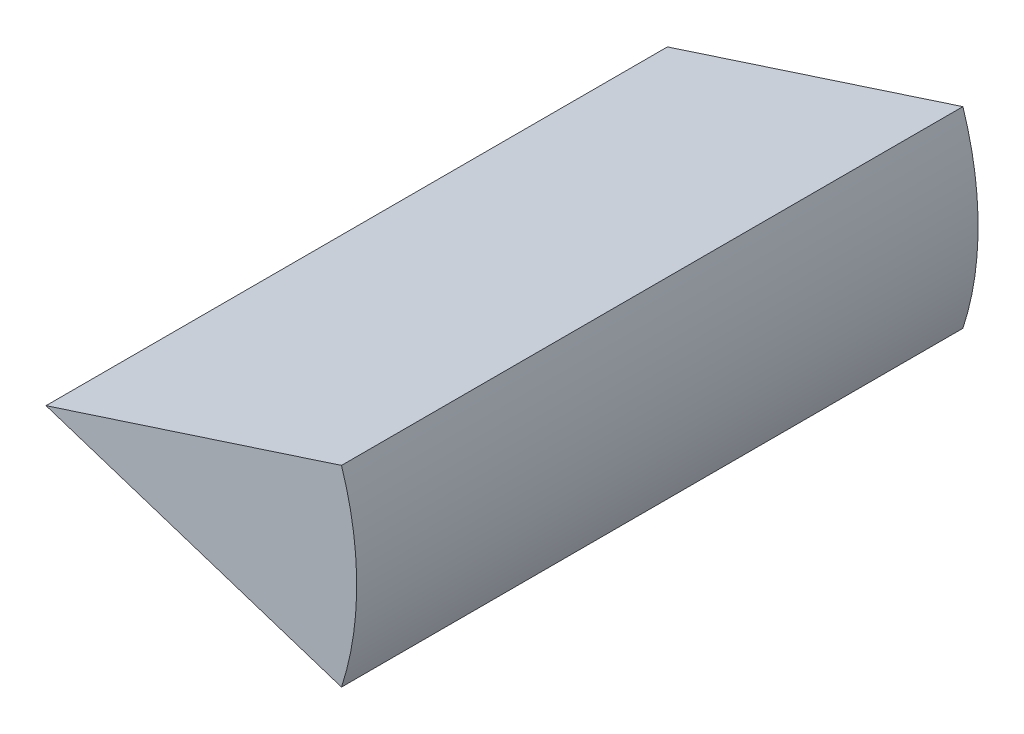
ISO-10303-21;
HEADER;
FILE_DESCRIPTION(('STEP AP214'),'2;1');
FILE_NAME('part.step','',(''),(''),'','','');
FILE_SCHEMA(('AUTOMOTIVE_DESIGN { 1 0 10303 214 1 1 1 1 }'));
ENDSEC;
DATA;
#1=APPLICATION_CONTEXT('core data for automotive mechanical design processes');
#2=APPLICATION_PROTOCOL_DEFINITION('international standard','automotive_design',2000,#1);
#3=PRODUCT_CONTEXT('',#1,'mechanical');
#4=PRODUCT('Part','Part','',(#3));
#5=PRODUCT_RELATED_PRODUCT_CATEGORY('part','',(#4));
#6=PRODUCT_DEFINITION_FORMATION('','',#4);
#7=PRODUCT_DEFINITION_CONTEXT('part definition',#1,'design');
#8=PRODUCT_DEFINITION('design','',#6,#7);
#9=PRODUCT_DEFINITION_SHAPE('','',#8);
#10=(LENGTH_UNIT() NAMED_UNIT(*) SI_UNIT(.MILLI.,.METRE.));
#11=(NAMED_UNIT(*) PLANE_ANGLE_UNIT() SI_UNIT($,.RADIAN.));
#12=(NAMED_UNIT(*) SI_UNIT($,.STERADIAN.) SOLID_ANGLE_UNIT());
#13=UNCERTAINTY_MEASURE_WITH_UNIT(LENGTH_MEASURE(1.E-05),#10,'distance_accuracy_value','');
#14=(GEOMETRIC_REPRESENTATION_CONTEXT(3) GLOBAL_UNCERTAINTY_ASSIGNED_CONTEXT((#13)) GLOBAL_UNIT_ASSIGNED_CONTEXT((#10,
#11,#12)) REPRESENTATION_CONTEXT('',''));
#15=CARTESIAN_POINT('',(0.,0.,0.));
#16=DIRECTION('',(0.,0.,1.));
#17=DIRECTION('',(1.,0.,0.));
#18=AXIS2_PLACEMENT_3D('',#15,#16,#17);
#19=CARTESIAN_POINT('',(0.,0.,50.));
#20=DIRECTION('',(0.309016994374944,0.951056516295155,0.));
#21=DIRECTION('',(-0.951056516295155,0.309016994374944,0.));
#22=AXIS2_PLACEMENT_3D('',#19,#20,#21);
#23=PLANE('',#22);
#24=DIRECTION('',(0.951056516295155,-0.309016994374944,0.));
#25=VECTOR('',#24,1.);
#26=CARTESIAN_POINT('',(0.,0.,0.));
#27=LINE('',#26,#25);
#28=CARTESIAN_POINT('',(0.,0.,0.));
#29=VERTEX_POINT('',#28);
#30=CARTESIAN_POINT('',(23.7764129073789,-7.72542485937361,0.));
#31=VERTEX_POINT('',#30);
#32=EDGE_CURVE('E80',#29,#31,#27,.T.);
#33=ORIENTED_EDGE('',*,*,#32,.T.);
#34=DIRECTION('',(0.,0.,-1.));
#35=VECTOR('',#34,1.);
#36=CARTESIAN_POINT('',(23.7764129073789,-7.72542485937361,50.));
#37=LINE('',#36,#35);
#38=CARTESIAN_POINT('',(23.7764129073789,-7.72542485937361,50.));
#39=VERTEX_POINT('',#38);
#40=EDGE_CURVE('E11',#39,#31,#37,.T.);
#41=ORIENTED_EDGE('',*,*,#40,.F.);
#42=DIRECTION('',(0.951056516295155,-0.309016994374944,0.));
#43=VECTOR('',#42,1.);
#44=CARTESIAN_POINT('',(0.,0.,50.));
#45=LINE('',#44,#43);
#46=CARTESIAN_POINT('',(0.,0.,50.));
#47=VERTEX_POINT('',#46);
#48=EDGE_CURVE('E73',#47,#39,#45,.T.);
#49=ORIENTED_EDGE('',*,*,#48,.F.);
#50=DIRECTION('',(0.,0.,-1.));
#51=VECTOR('',#50,1.);
#52=CARTESIAN_POINT('',(0.,0.,50.));
#53=LINE('',#52,#51);
#54=EDGE_CURVE('E81',#47,#29,#53,.T.);
#55=ORIENTED_EDGE('',*,*,#54,.T.);
#56=EDGE_LOOP('',(#33,#41,#49,#55));
#57=FACE_BOUND('',#56,.T.);
#58=ADVANCED_FACE('F33',(#57),#23,.F.);
#59=CARTESIAN_POINT('',(0.,0.,50.));
#60=DIRECTION('',(0.,0.,-1.));
#61=DIRECTION('',(-1.,0.,0.));
#62=AXIS2_PLACEMENT_3D('',#59,#60,#61);
#63=CYLINDRICAL_SURFACE('',#62,25.);
#64=CARTESIAN_POINT('',(0.,0.,0.));
#65=DIRECTION('',(0.,0.,1.));
#66=DIRECTION('',(1.,0.,0.));
#67=AXIS2_PLACEMENT_3D('',#64,#65,#66);
#68=CIRCLE('',#67,25.);
#69=CARTESIAN_POINT('',(23.7764129073788,7.7254248593738,0.));
#70=VERTEX_POINT('',#69);
#71=EDGE_CURVE('E61',#31,#70,#68,.T.);
#72=ORIENTED_EDGE('',*,*,#71,.T.);
#73=DIRECTION('',(0.,0.,-1.));
#74=VECTOR('',#73,1.);
#75=CARTESIAN_POINT('',(23.7764129073788,7.7254248593738,50.));
#76=LINE('',#75,#74);
#77=CARTESIAN_POINT('',(23.7764129073788,7.7254248593738,50.));
#78=VERTEX_POINT('',#77);
#79=EDGE_CURVE('E41',#78,#70,#76,.T.);
#80=ORIENTED_EDGE('',*,*,#79,.F.);
#81=CARTESIAN_POINT('',(0.,0.,50.));
#82=DIRECTION('',(0.,0.,1.));
#83=DIRECTION('',(1.,0.,0.));
#84=AXIS2_PLACEMENT_3D('',#81,#82,#83);
#85=CIRCLE('',#84,25.);
#86=EDGE_CURVE('E69',#39,#78,#85,.T.);
#87=ORIENTED_EDGE('',*,*,#86,.F.);
#88=ORIENTED_EDGE('',*,*,#40,.T.);
#89=EDGE_LOOP('',(#72,#80,#87,#88));
#90=FACE_BOUND('',#89,.T.);
#91=ADVANCED_FACE('F70',(#90),#63,.T.);
#92=CARTESIAN_POINT('',(0.,0.,50.));
#93=DIRECTION('',(0.309016994374952,-0.951056516295152,0.));
#94=DIRECTION('',(0.951056516295152,0.309016994374952,0.));
#95=AXIS2_PLACEMENT_3D('',#92,#93,#94);
#96=PLANE('',#95);
#97=DIRECTION('',(-0.951056516295152,-0.309016994374952,0.));
#98=VECTOR('',#97,1.);
#99=CARTESIAN_POINT('',(0.,0.,0.));
#100=LINE('',#99,#98);
#101=EDGE_CURVE('E66',#70,#29,#100,.T.);
#102=ORIENTED_EDGE('',*,*,#101,.T.);
#103=ORIENTED_EDGE('',*,*,#54,.F.);
#104=DIRECTION('',(-0.951056516295152,-0.309016994374952,0.));
#105=VECTOR('',#104,1.);
#106=CARTESIAN_POINT('',(0.,0.,50.));
#107=LINE('',#106,#105);
#108=EDGE_CURVE('E49',#78,#47,#107,.T.);
#109=ORIENTED_EDGE('',*,*,#108,.F.);
#110=ORIENTED_EDGE('',*,*,#79,.T.);
#111=EDGE_LOOP('',(#102,#103,#109,#110));
#112=FACE_BOUND('',#111,.T.);
#113=ADVANCED_FACE('F92',(#112),#96,.F.);
#114=CARTESIAN_POINT('',(0.,0.,50.));
#115=DIRECTION('',(0.,0.,1.));
#116=DIRECTION('',(1.,0.,0.));
#117=AXIS2_PLACEMENT_3D('',#114,#115,#116);
#118=PLANE('',#117);
#119=ORIENTED_EDGE('',*,*,#48,.T.);
#120=ORIENTED_EDGE('',*,*,#86,.T.);
#121=ORIENTED_EDGE('',*,*,#108,.T.);
#122=EDGE_LOOP('',(#119,#120,#121));
#123=FACE_BOUND('',#122,.T.);
#124=ADVANCED_FACE('F76',(#123),#118,.T.);
#125=CARTESIAN_POINT('',(0.,0.,0.));
#126=DIRECTION('',(0.,0.,1.));
#127=DIRECTION('',(1.,0.,0.));
#128=AXIS2_PLACEMENT_3D('',#125,#126,#127);
#129=PLANE('',#128);
#130=CARTESIAN_POINT('',(19.1138809799697,0.455622911953737,0.));
#131=DIRECTION('',(0.,0.,-1.));
#132=DIRECTION('',(-1.,0.,0.));
#133=AXIS2_PLACEMENT_3D('',#130,#131,#132);
#134=CIRCLE('',#133,4.96567183213884);
#135=CARTESIAN_POINT('',(14.1482091478308,0.455622911953737,0.));
#136=VERTEX_POINT('',#135);
#137=EDGE_CURVE('E87',#136,#136,#134,.T.);
#138=ORIENTED_EDGE('',*,*,#137,.F.);
#139=EDGE_LOOP('',(#138));
#140=FACE_BOUND('',#139,.T.);
#141=ORIENTED_EDGE('',*,*,#32,.F.);
#142=ORIENTED_EDGE('',*,*,#101,.F.);
#143=ORIENTED_EDGE('',*,*,#71,.F.);
#144=EDGE_LOOP('',(#141,#142,#143));
#145=FACE_BOUND('',#144,.T.);
#146=ADVANCED_FACE('F93',(#140,#145),#129,.F.);
#147=CARTESIAN_POINT('',(19.1138809799697,0.455622911953737,10.));
#148=DIRECTION('',(0.,0.,-1.));
#149=DIRECTION('',(-1.,0.,0.));
#150=AXIS2_PLACEMENT_3D('',#147,#148,#149);
#151=CYLINDRICAL_SURFACE('',#150,4.96567183213884);
#152=CARTESIAN_POINT('',(19.1138809799697,0.455622911953737,10.));
#153=DIRECTION('',(0.,0.,-1.));
#154=DIRECTION('',(-1.,0.,0.));
#155=AXIS2_PLACEMENT_3D('',#152,#153,#154);
#156=CIRCLE('',#155,4.96567183213884);
#157=CARTESIAN_POINT('',(14.1482091478308,0.455622911953737,10.));
#158=VERTEX_POINT('',#157);
#159=EDGE_CURVE('E83',#158,#158,#156,.T.);
#160=ORIENTED_EDGE('',*,*,#159,.F.);
#161=EDGE_LOOP('',(#160));
#162=FACE_BOUND('',#161,.T.);
#163=ORIENTED_EDGE('',*,*,#137,.T.);
#164=EDGE_LOOP('',(#163));
#165=FACE_BOUND('',#164,.T.);
#166=ADVANCED_FACE('F95',(#162,#165),#151,.F.);
#167=CARTESIAN_POINT('',(19.1138809799697,0.455622911953737,10.));
#168=DIRECTION('',(0.,0.,-1.));
#169=DIRECTION('',(-1.,0.,0.));
#170=AXIS2_PLACEMENT_3D('',#167,#168,#169);
#171=PLANE('',#170);
#172=ORIENTED_EDGE('',*,*,#159,.T.);
#173=EDGE_LOOP('',(#172));
#174=FACE_BOUND('',#173,.T.);
#175=ADVANCED_FACE('F102',(#174),#171,.T.);
#176=CLOSED_SHELL('',(#58,#91,#113,#124,#146,#166,#175));
#177=MANIFOLD_SOLID_BREP('B2',#176);
#178=ADVANCED_BREP_SHAPE_REPRESENTATION('',(#18,#177),#14);
#179=SHAPE_DEFINITION_REPRESENTATION(#9,#178);
ENDSEC;
END-ISO-10303-21;
